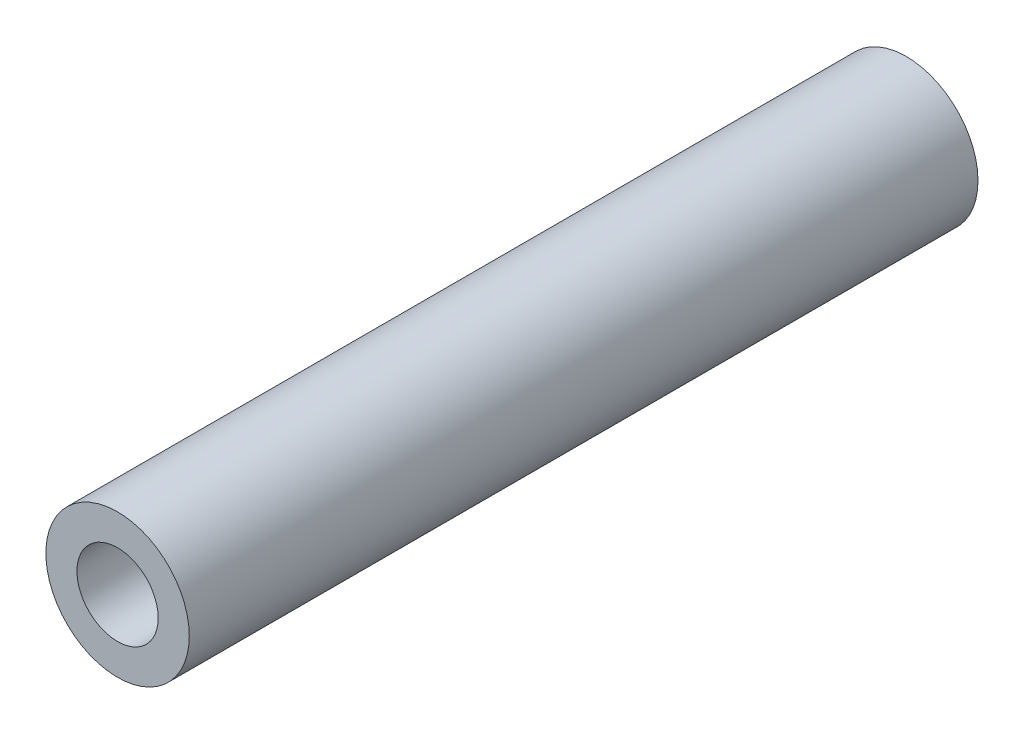
ISO-10303-21;
HEADER;
FILE_DESCRIPTION(('STEP AP214'),'2;1');
FILE_NAME('part.step','',(''),(''),'','','');
FILE_SCHEMA(('AUTOMOTIVE_DESIGN { 1 0 10303 214 1 1 1 1 }'));
ENDSEC;
DATA;
#1=APPLICATION_CONTEXT('core data for automotive mechanical design processes');
#2=APPLICATION_PROTOCOL_DEFINITION('international standard','automotive_design',2000,#1);
#3=PRODUCT_CONTEXT('',#1,'mechanical');
#4=PRODUCT('Part','Part','',(#3));
#5=PRODUCT_RELATED_PRODUCT_CATEGORY('part','',(#4));
#6=PRODUCT_DEFINITION_FORMATION('','',#4);
#7=PRODUCT_DEFINITION_CONTEXT('part definition',#1,'design');
#8=PRODUCT_DEFINITION('design','',#6,#7);
#9=PRODUCT_DEFINITION_SHAPE('','',#8);
#10=(LENGTH_UNIT() NAMED_UNIT(*) SI_UNIT(.MILLI.,.METRE.));
#11=(NAMED_UNIT(*) PLANE_ANGLE_UNIT() SI_UNIT($,.RADIAN.));
#12=(NAMED_UNIT(*) SI_UNIT($,.STERADIAN.) SOLID_ANGLE_UNIT());
#13=UNCERTAINTY_MEASURE_WITH_UNIT(LENGTH_MEASURE(1.E-05),#10,'distance_accuracy_value','');
#14=(GEOMETRIC_REPRESENTATION_CONTEXT(3) GLOBAL_UNCERTAINTY_ASSIGNED_CONTEXT((#13)) GLOBAL_UNIT_ASSIGNED_CONTEXT((#10,
#11,#12)) REPRESENTATION_CONTEXT('',''));
#15=CARTESIAN_POINT('',(0.,0.,0.));
#16=DIRECTION('',(0.,0.,1.));
#17=DIRECTION('',(1.,0.,0.));
#18=AXIS2_PLACEMENT_3D('',#15,#16,#17);
#19=CARTESIAN_POINT('',(0.,0.,33.));
#20=DIRECTION('',(0.,0.,1.));
#21=DIRECTION('',(1.,0.,0.));
#22=AXIS2_PLACEMENT_3D('',#19,#20,#21);
#23=PLANE('',#22);
#24=CARTESIAN_POINT('',(0.,0.,33.));
#25=DIRECTION('',(0.,0.,1.));
#26=DIRECTION('',(1.,0.,0.));
#27=AXIS2_PLACEMENT_3D('',#24,#25,#26);
#28=CIRCLE('',#27,3.);
#29=CARTESIAN_POINT('',(3.,0.,33.));
#30=VERTEX_POINT('',#29);
#31=EDGE_CURVE('E10',#30,#30,#28,.T.);
#32=ORIENTED_EDGE('',*,*,#31,.T.);
#33=EDGE_LOOP('',(#32));
#34=FACE_BOUND('',#33,.T.);
#35=CARTESIAN_POINT('',(0.,0.,33.));
#36=DIRECTION('',(0.,0.,1.));
#37=DIRECTION('',(1.,0.,0.));
#38=AXIS2_PLACEMENT_3D('',#35,#36,#37);
#39=CIRCLE('',#38,1.7);
#40=CARTESIAN_POINT('',(1.7,0.,33.));
#41=VERTEX_POINT('',#40);
#42=EDGE_CURVE('E48',#41,#41,#39,.T.);
#43=ORIENTED_EDGE('',*,*,#42,.F.);
#44=EDGE_LOOP('',(#43));
#45=FACE_BOUND('',#44,.T.);
#46=ADVANCED_FACE('F40',(#34,#45),#23,.T.);
#47=CARTESIAN_POINT('',(0.,0.,0.));
#48=DIRECTION('',(0.,0.,1.));
#49=DIRECTION('',(1.,0.,0.));
#50=AXIS2_PLACEMENT_3D('',#47,#48,#49);
#51=PLANE('',#50);
#52=CARTESIAN_POINT('',(0.,0.,0.));
#53=DIRECTION('',(0.,0.,1.));
#54=DIRECTION('',(1.,0.,0.));
#55=AXIS2_PLACEMENT_3D('',#52,#53,#54);
#56=CIRCLE('',#55,3.);
#57=CARTESIAN_POINT('',(3.,0.,0.));
#58=VERTEX_POINT('',#57);
#59=EDGE_CURVE('E41',#58,#58,#56,.T.);
#60=ORIENTED_EDGE('',*,*,#59,.F.);
#61=EDGE_LOOP('',(#60));
#62=FACE_BOUND('',#61,.T.);
#63=CARTESIAN_POINT('',(0.,0.,0.));
#64=DIRECTION('',(0.,0.,1.));
#65=DIRECTION('',(1.,0.,0.));
#66=AXIS2_PLACEMENT_3D('',#63,#64,#65);
#67=CIRCLE('',#66,1.7);
#68=CARTESIAN_POINT('',(1.7,0.,0.));
#69=VERTEX_POINT('',#68);
#70=EDGE_CURVE('E49',#69,#69,#67,.T.);
#71=ORIENTED_EDGE('',*,*,#70,.T.);
#72=EDGE_LOOP('',(#71));
#73=FACE_BOUND('',#72,.T.);
#74=ADVANCED_FACE('F58',(#62,#73),#51,.F.);
#75=CARTESIAN_POINT('',(0.,0.,33.));
#76=DIRECTION('',(0.,0.,-1.));
#77=DIRECTION('',(-1.,0.,0.));
#78=AXIS2_PLACEMENT_3D('',#75,#76,#77);
#79=CYLINDRICAL_SURFACE('',#78,3.);
#80=ORIENTED_EDGE('',*,*,#31,.F.);
#81=EDGE_LOOP('',(#80));
#82=FACE_BOUND('',#81,.T.);
#83=ORIENTED_EDGE('',*,*,#59,.T.);
#84=EDGE_LOOP('',(#83));
#85=FACE_BOUND('',#84,.T.);
#86=ADVANCED_FACE('F39',(#82,#85),#79,.T.);
#87=CARTESIAN_POINT('',(0.,0.,33.));
#88=DIRECTION('',(0.,0.,-1.));
#89=DIRECTION('',(-1.,0.,0.));
#90=AXIS2_PLACEMENT_3D('',#87,#88,#89);
#91=CYLINDRICAL_SURFACE('',#90,1.7);
#92=ORIENTED_EDGE('',*,*,#42,.T.);
#93=EDGE_LOOP('',(#92));
#94=FACE_BOUND('',#93,.T.);
#95=ORIENTED_EDGE('',*,*,#70,.F.);
#96=EDGE_LOOP('',(#95));
#97=FACE_BOUND('',#96,.T.);
#98=ADVANCED_FACE('F57',(#94,#97),#91,.F.);
#99=CLOSED_SHELL('',(#46,#74,#86,#98));
#100=MANIFOLD_SOLID_BREP('B2',#99);
#101=ADVANCED_BREP_SHAPE_REPRESENTATION('',(#18,#100),#14);
#102=SHAPE_DEFINITION_REPRESENTATION(#9,#101);
ENDSEC;
END-ISO-10303-21;
